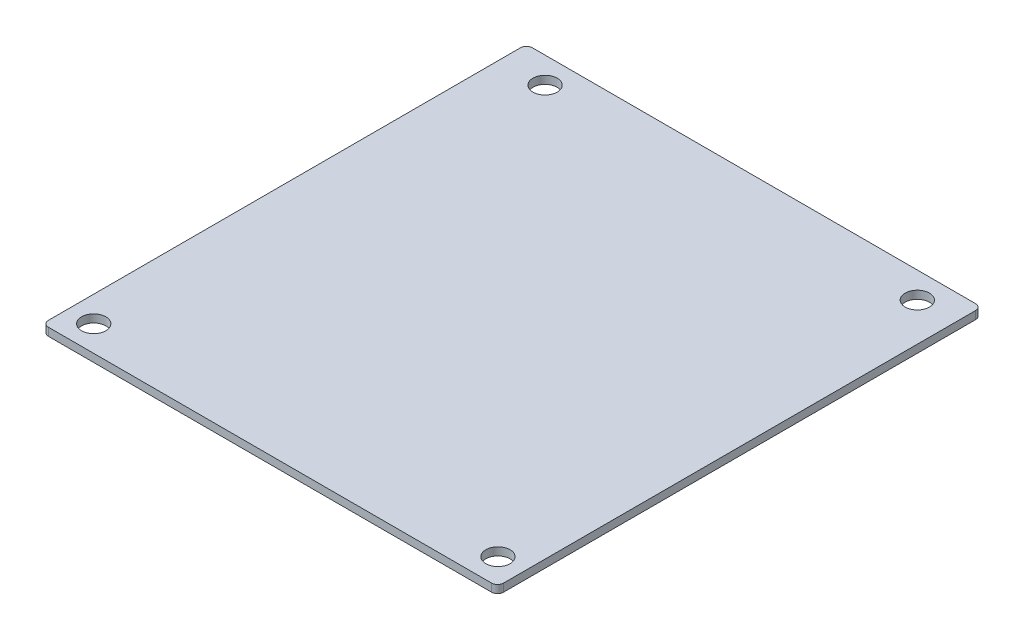
ISO-10303-21;
HEADER;
FILE_DESCRIPTION(('STEP AP214'),'2;1');
FILE_NAME('part.step','',(''),(''),'','','');
FILE_SCHEMA(('AUTOMOTIVE_DESIGN { 1 0 10303 214 1 1 1 1 }'));
ENDSEC;
DATA;
#1=APPLICATION_CONTEXT('core data for automotive mechanical design processes');
#2=APPLICATION_PROTOCOL_DEFINITION('international standard','automotive_design',2000,#1);
#3=PRODUCT_CONTEXT('',#1,'mechanical');
#4=PRODUCT('Part','Part','',(#3));
#5=PRODUCT_RELATED_PRODUCT_CATEGORY('part','',(#4));
#6=PRODUCT_DEFINITION_FORMATION('','',#4);
#7=PRODUCT_DEFINITION_CONTEXT('part definition',#1,'design');
#8=PRODUCT_DEFINITION('design','',#6,#7);
#9=PRODUCT_DEFINITION_SHAPE('','',#8);
#10=(LENGTH_UNIT() NAMED_UNIT(*) SI_UNIT(.MILLI.,.METRE.));
#11=(NAMED_UNIT(*) PLANE_ANGLE_UNIT() SI_UNIT($,.RADIAN.));
#12=(NAMED_UNIT(*) SI_UNIT($,.STERADIAN.) SOLID_ANGLE_UNIT());
#13=UNCERTAINTY_MEASURE_WITH_UNIT(LENGTH_MEASURE(1.E-05),#10,'distance_accuracy_value','');
#14=(GEOMETRIC_REPRESENTATION_CONTEXT(3) GLOBAL_UNCERTAINTY_ASSIGNED_CONTEXT((#13)) GLOBAL_UNIT_ASSIGNED_CONTEXT((#10,
#11,#12)) REPRESENTATION_CONTEXT('',''));
#15=CARTESIAN_POINT('',(0.,0.,0.));
#16=DIRECTION('',(0.,0.,1.));
#17=DIRECTION('',(1.,0.,0.));
#18=AXIS2_PLACEMENT_3D('',#15,#16,#17);
#19=CARTESIAN_POINT('',(45.085,1.57,47.945));
#20=DIRECTION('',(-1.,0.,0.));
#21=DIRECTION('',(0.,0.,1.));
#22=AXIS2_PLACEMENT_3D('',#19,#20,#21);
#23=PLANE('',#22);
#24=DIRECTION('',(0.,0.,-1.));
#25=VECTOR('',#24,1.);
#26=CARTESIAN_POINT('',(45.085,0.,47.945));
#27=LINE('',#26,#25);
#28=CARTESIAN_POINT('',(45.085,0.,46.745));
#29=VERTEX_POINT('',#28);
#30=CARTESIAN_POINT('',(45.085,0.,-46.745));
#31=VERTEX_POINT('',#30);
#32=EDGE_CURVE('E113',#29,#31,#27,.T.);
#33=ORIENTED_EDGE('',*,*,#32,.T.);
#34=DIRECTION('',(0.,-1.,0.));
#35=VECTOR('',#34,1.);
#36=CARTESIAN_POINT('',(45.085,1.57,-46.745));
#37=LINE('',#36,#35);
#38=CARTESIAN_POINT('',(45.085,1.57,-46.745));
#39=VERTEX_POINT('',#38);
#40=EDGE_CURVE('E144',#31,#39,#37,.F.);
#41=ORIENTED_EDGE('',*,*,#40,.T.);
#42=DIRECTION('',(0.,0.,-1.));
#43=VECTOR('',#42,1.);
#44=CARTESIAN_POINT('',(45.085,1.57,47.945));
#45=LINE('',#44,#43);
#46=CARTESIAN_POINT('',(45.085,1.57,46.745));
#47=VERTEX_POINT('',#46);
#48=EDGE_CURVE('E116',#47,#39,#45,.T.);
#49=ORIENTED_EDGE('',*,*,#48,.F.);
#50=DIRECTION('',(0.,-1.,0.));
#51=VECTOR('',#50,1.);
#52=CARTESIAN_POINT('',(45.085,1.57,46.745));
#53=LINE('',#52,#51);
#54=EDGE_CURVE('E105',#47,#29,#53,.T.);
#55=ORIENTED_EDGE('',*,*,#54,.T.);
#56=EDGE_LOOP('',(#33,#41,#49,#55));
#57=FACE_BOUND('',#56,.T.);
#58=ADVANCED_FACE('F35',(#57),#23,.F.);
#59=CARTESIAN_POINT('',(-45.085,1.57,-47.945));
#60=DIRECTION('',(0.,0.,1.));
#61=DIRECTION('',(1.,0.,0.));
#62=AXIS2_PLACEMENT_3D('',#59,#60,#61);
#63=PLANE('',#62);
#64=DIRECTION('',(-1.,0.,0.));
#65=VECTOR('',#64,1.);
#66=CARTESIAN_POINT('',(-45.085,0.,-47.945));
#67=LINE('',#66,#65);
#68=CARTESIAN_POINT('',(43.885,0.,-47.945));
#69=VERTEX_POINT('',#68);
#70=CARTESIAN_POINT('',(-43.885,0.,-47.945));
#71=VERTEX_POINT('',#70);
#72=EDGE_CURVE('E122',#69,#71,#67,.T.);
#73=ORIENTED_EDGE('',*,*,#72,.T.);
#74=DIRECTION('',(0.,-1.,0.));
#75=VECTOR('',#74,1.);
#76=CARTESIAN_POINT('',(-43.885,1.57,-47.945));
#77=LINE('',#76,#75);
#78=CARTESIAN_POINT('',(-43.885,1.57,-47.945));
#79=VERTEX_POINT('',#78);
#80=EDGE_CURVE('E153',#71,#79,#77,.F.);
#81=ORIENTED_EDGE('',*,*,#80,.T.);
#82=DIRECTION('',(-1.,0.,0.));
#83=VECTOR('',#82,1.);
#84=CARTESIAN_POINT('',(-45.085,1.57,-47.945));
#85=LINE('',#84,#83);
#86=CARTESIAN_POINT('',(43.885,1.57,-47.945));
#87=VERTEX_POINT('',#86);
#88=EDGE_CURVE('E172',#87,#79,#85,.T.);
#89=ORIENTED_EDGE('',*,*,#88,.F.);
#90=DIRECTION('',(0.,-1.,0.));
#91=VECTOR('',#90,1.);
#92=CARTESIAN_POINT('',(43.885,1.57,-47.945));
#93=LINE('',#92,#91);
#94=EDGE_CURVE('E140',#87,#69,#93,.T.);
#95=ORIENTED_EDGE('',*,*,#94,.T.);
#96=EDGE_LOOP('',(#73,#81,#89,#95));
#97=FACE_BOUND('',#96,.T.);
#98=ADVANCED_FACE('F229',(#97),#63,.F.);
#99=CARTESIAN_POINT('',(-45.085,1.57,47.945));
#100=DIRECTION('',(1.,0.,0.));
#101=DIRECTION('',(0.,0.,-1.));
#102=AXIS2_PLACEMENT_3D('',#99,#100,#101);
#103=PLANE('',#102);
#104=DIRECTION('',(0.,0.,1.));
#105=VECTOR('',#104,1.);
#106=CARTESIAN_POINT('',(-45.085,0.,47.945));
#107=LINE('',#106,#105);
#108=CARTESIAN_POINT('',(-45.085,0.,-46.745));
#109=VERTEX_POINT('',#108);
#110=CARTESIAN_POINT('',(-45.085,0.,46.745));
#111=VERTEX_POINT('',#110);
#112=EDGE_CURVE('E126',#109,#111,#107,.T.);
#113=ORIENTED_EDGE('',*,*,#112,.T.);
#114=DIRECTION('',(0.,-1.,0.));
#115=VECTOR('',#114,1.);
#116=CARTESIAN_POINT('',(-45.085,1.57,46.745));
#117=LINE('',#116,#115);
#118=CARTESIAN_POINT('',(-45.085,1.57,46.745));
#119=VERTEX_POINT('',#118);
#120=EDGE_CURVE('E43',#111,#119,#117,.F.);
#121=ORIENTED_EDGE('',*,*,#120,.T.);
#122=DIRECTION('',(0.,0.,1.));
#123=VECTOR('',#122,1.);
#124=CARTESIAN_POINT('',(-45.085,1.57,47.945));
#125=LINE('',#124,#123);
#126=CARTESIAN_POINT('',(-45.085,1.57,-46.745));
#127=VERTEX_POINT('',#126);
#128=EDGE_CURVE('E168',#127,#119,#125,.T.);
#129=ORIENTED_EDGE('',*,*,#128,.F.);
#130=DIRECTION('',(0.,-1.,0.));
#131=VECTOR('',#130,1.);
#132=CARTESIAN_POINT('',(-45.085,1.57,-46.745));
#133=LINE('',#132,#131);
#134=EDGE_CURVE('E148',#127,#109,#133,.T.);
#135=ORIENTED_EDGE('',*,*,#134,.T.);
#136=EDGE_LOOP('',(#113,#121,#129,#135));
#137=FACE_BOUND('',#136,.T.);
#138=ADVANCED_FACE('F234',(#137),#103,.F.);
#139=CARTESIAN_POINT('',(-45.085,1.57,47.945));
#140=DIRECTION('',(0.,0.,-1.));
#141=DIRECTION('',(-1.,0.,0.));
#142=AXIS2_PLACEMENT_3D('',#139,#140,#141);
#143=PLANE('',#142);
#144=DIRECTION('',(1.,0.,0.));
#145=VECTOR('',#144,1.);
#146=CARTESIAN_POINT('',(-45.085,1.57,47.945));
#147=LINE('',#146,#145);
#148=CARTESIAN_POINT('',(-43.885,1.57,47.945));
#149=VERTEX_POINT('',#148);
#150=CARTESIAN_POINT('',(43.885,1.57,47.945));
#151=VERTEX_POINT('',#150);
#152=EDGE_CURVE('E117',#149,#151,#147,.T.);
#153=ORIENTED_EDGE('',*,*,#152,.F.);
#154=DIRECTION('',(0.,-1.,0.));
#155=VECTOR('',#154,1.);
#156=CARTESIAN_POINT('',(-43.885,1.57,47.945));
#157=LINE('',#156,#155);
#158=CARTESIAN_POINT('',(-43.885,0.,47.945));
#159=VERTEX_POINT('',#158);
#160=EDGE_CURVE('E157',#149,#159,#157,.T.);
#161=ORIENTED_EDGE('',*,*,#160,.T.);
#162=DIRECTION('',(1.,0.,0.));
#163=VECTOR('',#162,1.);
#164=CARTESIAN_POINT('',(-45.085,0.,47.945));
#165=LINE('',#164,#163);
#166=CARTESIAN_POINT('',(43.885,0.,47.945));
#167=VERTEX_POINT('',#166);
#168=EDGE_CURVE('E135',#159,#167,#165,.T.);
#169=ORIENTED_EDGE('',*,*,#168,.T.);
#170=DIRECTION('',(0.,-1.,0.));
#171=VECTOR('',#170,1.);
#172=CARTESIAN_POINT('',(43.885,1.57,47.945));
#173=LINE('',#172,#171);
#174=EDGE_CURVE('E107',#167,#151,#173,.F.);
#175=ORIENTED_EDGE('',*,*,#174,.T.);
#176=EDGE_LOOP('',(#153,#161,#169,#175));
#177=FACE_BOUND('',#176,.T.);
#178=ADVANCED_FACE('F163',(#177),#143,.F.);
#179=CARTESIAN_POINT('',(0.,1.57,0.));
#180=DIRECTION('',(0.,-1.,0.));
#181=DIRECTION('',(0.,0.,-1.));
#182=AXIS2_PLACEMENT_3D('',#179,#180,#181);
#183=PLANE('',#182);
#184=CARTESIAN_POINT('',(37.515,1.57,-42.785));
#185=DIRECTION('',(0.,1.,0.));
#186=DIRECTION('',(0.,0.,1.));
#187=AXIS2_PLACEMENT_3D('',#184,#185,#186);
#188=CIRCLE('',#187,2.4);
#189=CARTESIAN_POINT('',(37.515,1.57,-40.385));
#190=VERTEX_POINT('',#189);
#191=EDGE_CURVE('E191',#190,#190,#188,.T.);
#192=ORIENTED_EDGE('',*,*,#191,.F.);
#193=EDGE_LOOP('',(#192));
#194=FACE_BOUND('',#193,.T.);
#195=CARTESIAN_POINT('',(-36.235,1.57,-42.785));
#196=DIRECTION('',(0.,1.,0.));
#197=DIRECTION('',(0.,0.,1.));
#198=AXIS2_PLACEMENT_3D('',#195,#196,#197);
#199=CIRCLE('',#198,2.4);
#200=CARTESIAN_POINT('',(-36.235,1.57,-40.385));
#201=VERTEX_POINT('',#200);
#202=EDGE_CURVE('E185',#201,#201,#199,.T.);
#203=ORIENTED_EDGE('',*,*,#202,.F.);
#204=EDGE_LOOP('',(#203));
#205=FACE_BOUND('',#204,.T.);
#206=CARTESIAN_POINT('',(40.005,1.57,42.785));
#207=DIRECTION('',(0.,1.,0.));
#208=DIRECTION('',(0.,0.,1.));
#209=AXIS2_PLACEMENT_3D('',#206,#207,#208);
#210=CIRCLE('',#209,2.4);
#211=CARTESIAN_POINT('',(40.005,1.57,45.185));
#212=VERTEX_POINT('',#211);
#213=EDGE_CURVE('E179',#212,#212,#210,.T.);
#214=ORIENTED_EDGE('',*,*,#213,.F.);
#215=EDGE_LOOP('',(#214));
#216=FACE_BOUND('',#215,.T.);
#217=CARTESIAN_POINT('',(-40.005,1.57,42.865));
#218=DIRECTION('',(0.,1.,0.));
#219=DIRECTION('',(0.,0.,1.));
#220=AXIS2_PLACEMENT_3D('',#217,#218,#219);
#221=CIRCLE('',#220,2.4);
#222=CARTESIAN_POINT('',(-40.005,1.57,45.265));
#223=VERTEX_POINT('',#222);
#224=EDGE_CURVE('E129',#223,#223,#221,.T.);
#225=ORIENTED_EDGE('',*,*,#224,.F.);
#226=EDGE_LOOP('',(#225));
#227=FACE_BOUND('',#226,.T.);
#228=ORIENTED_EDGE('',*,*,#128,.T.);
#229=CARTESIAN_POINT('',(-43.885,1.57,46.745));
#230=DIRECTION('',(0.,-1.,0.));
#231=DIRECTION('',(0.,0.,-1.));
#232=AXIS2_PLACEMENT_3D('',#229,#230,#231);
#233=CIRCLE('',#232,1.2);
#234=EDGE_CURVE('E11',#119,#149,#233,.F.);
#235=ORIENTED_EDGE('',*,*,#234,.T.);
#236=ORIENTED_EDGE('',*,*,#152,.T.);
#237=CARTESIAN_POINT('',(43.885,1.57,46.745));
#238=DIRECTION('',(0.,-1.,0.));
#239=DIRECTION('',(0.,0.,-1.));
#240=AXIS2_PLACEMENT_3D('',#237,#238,#239);
#241=CIRCLE('',#240,1.2);
#242=EDGE_CURVE('E138',#151,#47,#241,.F.);
#243=ORIENTED_EDGE('',*,*,#242,.T.);
#244=ORIENTED_EDGE('',*,*,#48,.T.);
#245=CARTESIAN_POINT('',(43.885,1.57,-46.745));
#246=DIRECTION('',(0.,-1.,0.));
#247=DIRECTION('',(0.,0.,-1.));
#248=AXIS2_PLACEMENT_3D('',#245,#246,#247);
#249=CIRCLE('',#248,1.2);
#250=EDGE_CURVE('E146',#39,#87,#249,.F.);
#251=ORIENTED_EDGE('',*,*,#250,.T.);
#252=ORIENTED_EDGE('',*,*,#88,.T.);
#253=CARTESIAN_POINT('',(-43.885,1.57,-46.745));
#254=DIRECTION('',(0.,-1.,0.));
#255=DIRECTION('',(0.,0.,-1.));
#256=AXIS2_PLACEMENT_3D('',#253,#254,#255);
#257=CIRCLE('',#256,1.2);
#258=EDGE_CURVE('E155',#79,#127,#257,.F.);
#259=ORIENTED_EDGE('',*,*,#258,.T.);
#260=EDGE_LOOP('',(#228,#235,#236,#243,#244,#251,#252,#259));
#261=FACE_BOUND('',#260,.T.);
#262=ADVANCED_FACE('F167',(#194,#205,#216,#227,#261),#183,.F.);
#263=CARTESIAN_POINT('',(0.,0.,0.));
#264=DIRECTION('',(0.,-1.,0.));
#265=DIRECTION('',(0.,0.,-1.));
#266=AXIS2_PLACEMENT_3D('',#263,#264,#265);
#267=PLANE('',#266);
#268=CARTESIAN_POINT('',(37.515,0.,-42.785));
#269=DIRECTION('',(0.,1.,0.));
#270=DIRECTION('',(0.,0.,1.));
#271=AXIS2_PLACEMENT_3D('',#268,#269,#270);
#272=CIRCLE('',#271,2.4);
#273=CARTESIAN_POINT('',(37.515,0.,-40.385));
#274=VERTEX_POINT('',#273);
#275=EDGE_CURVE('E188',#274,#274,#272,.T.);
#276=ORIENTED_EDGE('',*,*,#275,.T.);
#277=EDGE_LOOP('',(#276));
#278=FACE_BOUND('',#277,.T.);
#279=CARTESIAN_POINT('',(-36.235,0.,-42.785));
#280=DIRECTION('',(0.,1.,0.));
#281=DIRECTION('',(0.,0.,1.));
#282=AXIS2_PLACEMENT_3D('',#279,#280,#281);
#283=CIRCLE('',#282,2.4);
#284=CARTESIAN_POINT('',(-36.235,0.,-40.385));
#285=VERTEX_POINT('',#284);
#286=EDGE_CURVE('E182',#285,#285,#283,.T.);
#287=ORIENTED_EDGE('',*,*,#286,.T.);
#288=EDGE_LOOP('',(#287));
#289=FACE_BOUND('',#288,.T.);
#290=CARTESIAN_POINT('',(40.005,0.,42.785));
#291=DIRECTION('',(0.,1.,0.));
#292=DIRECTION('',(0.,0.,1.));
#293=AXIS2_PLACEMENT_3D('',#290,#291,#292);
#294=CIRCLE('',#293,2.4);
#295=CARTESIAN_POINT('',(40.005,0.,45.185));
#296=VERTEX_POINT('',#295);
#297=EDGE_CURVE('E177',#296,#296,#294,.T.);
#298=ORIENTED_EDGE('',*,*,#297,.T.);
#299=EDGE_LOOP('',(#298));
#300=FACE_BOUND('',#299,.T.);
#301=CARTESIAN_POINT('',(-40.005,0.,42.865));
#302=DIRECTION('',(0.,1.,0.));
#303=DIRECTION('',(0.,0.,1.));
#304=AXIS2_PLACEMENT_3D('',#301,#302,#303);
#305=CIRCLE('',#304,2.4);
#306=CARTESIAN_POINT('',(-40.005,0.,45.265));
#307=VERTEX_POINT('',#306);
#308=EDGE_CURVE('E123',#307,#307,#305,.T.);
#309=ORIENTED_EDGE('',*,*,#308,.T.);
#310=EDGE_LOOP('',(#309));
#311=FACE_BOUND('',#310,.T.);
#312=ORIENTED_EDGE('',*,*,#168,.F.);
#313=CARTESIAN_POINT('',(-43.885,0.,46.745));
#314=DIRECTION('',(0.,-1.,0.));
#315=DIRECTION('',(0.,0.,-1.));
#316=AXIS2_PLACEMENT_3D('',#313,#314,#315);
#317=CIRCLE('',#316,1.2);
#318=EDGE_CURVE('E57',#159,#111,#317,.T.);
#319=ORIENTED_EDGE('',*,*,#318,.T.);
#320=ORIENTED_EDGE('',*,*,#112,.F.);
#321=CARTESIAN_POINT('',(-43.885,0.,-46.745));
#322=DIRECTION('',(0.,-1.,0.));
#323=DIRECTION('',(0.,0.,-1.));
#324=AXIS2_PLACEMENT_3D('',#321,#322,#323);
#325=CIRCLE('',#324,1.2);
#326=EDGE_CURVE('E151',#109,#71,#325,.T.);
#327=ORIENTED_EDGE('',*,*,#326,.T.);
#328=ORIENTED_EDGE('',*,*,#72,.F.);
#329=CARTESIAN_POINT('',(43.885,0.,-46.745));
#330=DIRECTION('',(0.,-1.,0.));
#331=DIRECTION('',(0.,0.,-1.));
#332=AXIS2_PLACEMENT_3D('',#329,#330,#331);
#333=CIRCLE('',#332,1.2);
#334=EDGE_CURVE('E121',#69,#31,#333,.T.);
#335=ORIENTED_EDGE('',*,*,#334,.T.);
#336=ORIENTED_EDGE('',*,*,#32,.F.);
#337=CARTESIAN_POINT('',(43.885,0.,46.745));
#338=DIRECTION('',(0.,-1.,0.));
#339=DIRECTION('',(0.,0.,-1.));
#340=AXIS2_PLACEMENT_3D('',#337,#338,#339);
#341=CIRCLE('',#340,1.2);
#342=EDGE_CURVE('E101',#29,#167,#341,.T.);
#343=ORIENTED_EDGE('',*,*,#342,.T.);
#344=EDGE_LOOP('',(#312,#319,#320,#327,#328,#335,#336,#343));
#345=FACE_BOUND('',#344,.T.);
#346=ADVANCED_FACE('F119',(#278,#289,#300,#311,#345),#267,.T.);
#347=CARTESIAN_POINT('',(-40.005,0.,42.865));
#348=DIRECTION('',(0.,1.,0.));
#349=DIRECTION('',(0.,0.,1.));
#350=AXIS2_PLACEMENT_3D('',#347,#348,#349);
#351=CYLINDRICAL_SURFACE('',#350,2.4);
#352=ORIENTED_EDGE('',*,*,#308,.F.);
#353=EDGE_LOOP('',(#352));
#354=FACE_BOUND('',#353,.T.);
#355=ORIENTED_EDGE('',*,*,#224,.T.);
#356=EDGE_LOOP('',(#355));
#357=FACE_BOUND('',#356,.T.);
#358=ADVANCED_FACE('F215',(#354,#357),#351,.F.);
#359=CARTESIAN_POINT('',(40.005,0.,42.785));
#360=DIRECTION('',(0.,1.,0.));
#361=DIRECTION('',(0.,0.,1.));
#362=AXIS2_PLACEMENT_3D('',#359,#360,#361);
#363=CYLINDRICAL_SURFACE('',#362,2.4);
#364=ORIENTED_EDGE('',*,*,#297,.F.);
#365=EDGE_LOOP('',(#364));
#366=FACE_BOUND('',#365,.T.);
#367=ORIENTED_EDGE('',*,*,#213,.T.);
#368=EDGE_LOOP('',(#367));
#369=FACE_BOUND('',#368,.T.);
#370=ADVANCED_FACE('F217',(#366,#369),#363,.F.);
#371=CARTESIAN_POINT('',(-36.235,0.,-42.785));
#372=DIRECTION('',(0.,1.,0.));
#373=DIRECTION('',(0.,0.,1.));
#374=AXIS2_PLACEMENT_3D('',#371,#372,#373);
#375=CYLINDRICAL_SURFACE('',#374,2.4);
#376=ORIENTED_EDGE('',*,*,#286,.F.);
#377=EDGE_LOOP('',(#376));
#378=FACE_BOUND('',#377,.T.);
#379=ORIENTED_EDGE('',*,*,#202,.T.);
#380=EDGE_LOOP('',(#379));
#381=FACE_BOUND('',#380,.T.);
#382=ADVANCED_FACE('F202',(#378,#381),#375,.F.);
#383=CARTESIAN_POINT('',(37.515,0.,-42.785));
#384=DIRECTION('',(0.,1.,0.));
#385=DIRECTION('',(0.,0.,1.));
#386=AXIS2_PLACEMENT_3D('',#383,#384,#385);
#387=CYLINDRICAL_SURFACE('',#386,2.4);
#388=ORIENTED_EDGE('',*,*,#275,.F.);
#389=EDGE_LOOP('',(#388));
#390=FACE_BOUND('',#389,.T.);
#391=ORIENTED_EDGE('',*,*,#191,.T.);
#392=EDGE_LOOP('',(#391));
#393=FACE_BOUND('',#392,.T.);
#394=ADVANCED_FACE('F199',(#390,#393),#387,.F.);
#395=CARTESIAN_POINT('',(43.885,1.57,46.745));
#396=DIRECTION('',(0.,-1.,0.));
#397=DIRECTION('',(0.,0.,-1.));
#398=AXIS2_PLACEMENT_3D('',#395,#396,#397);
#399=CYLINDRICAL_SURFACE('',#398,1.2);
#400=ORIENTED_EDGE('',*,*,#242,.F.);
#401=ORIENTED_EDGE('',*,*,#174,.F.);
#402=ORIENTED_EDGE('',*,*,#342,.F.);
#403=ORIENTED_EDGE('',*,*,#54,.F.);
#404=EDGE_LOOP('',(#400,#401,#402,#403));
#405=FACE_BOUND('',#404,.T.);
#406=ADVANCED_FACE('F104',(#405),#399,.T.);
#407=CARTESIAN_POINT('',(43.885,1.57,-46.745));
#408=DIRECTION('',(0.,-1.,0.));
#409=DIRECTION('',(0.,0.,-1.));
#410=AXIS2_PLACEMENT_3D('',#407,#408,#409);
#411=CYLINDRICAL_SURFACE('',#410,1.2);
#412=ORIENTED_EDGE('',*,*,#250,.F.);
#413=ORIENTED_EDGE('',*,*,#40,.F.);
#414=ORIENTED_EDGE('',*,*,#334,.F.);
#415=ORIENTED_EDGE('',*,*,#94,.F.);
#416=EDGE_LOOP('',(#412,#413,#414,#415));
#417=FACE_BOUND('',#416,.T.);
#418=ADVANCED_FACE('F241',(#417),#411,.T.);
#419=CARTESIAN_POINT('',(-43.885,1.57,-46.745));
#420=DIRECTION('',(0.,-1.,0.));
#421=DIRECTION('',(0.,0.,-1.));
#422=AXIS2_PLACEMENT_3D('',#419,#420,#421);
#423=CYLINDRICAL_SURFACE('',#422,1.2);
#424=ORIENTED_EDGE('',*,*,#258,.F.);
#425=ORIENTED_EDGE('',*,*,#80,.F.);
#426=ORIENTED_EDGE('',*,*,#326,.F.);
#427=ORIENTED_EDGE('',*,*,#134,.F.);
#428=EDGE_LOOP('',(#424,#425,#426,#427));
#429=FACE_BOUND('',#428,.T.);
#430=ADVANCED_FACE('F243',(#429),#423,.T.);
#431=CARTESIAN_POINT('',(-43.885,1.57,46.745));
#432=DIRECTION('',(0.,-1.,0.));
#433=DIRECTION('',(0.,0.,-1.));
#434=AXIS2_PLACEMENT_3D('',#431,#432,#433);
#435=CYLINDRICAL_SURFACE('',#434,1.2);
#436=ORIENTED_EDGE('',*,*,#234,.F.);
#437=ORIENTED_EDGE('',*,*,#120,.F.);
#438=ORIENTED_EDGE('',*,*,#318,.F.);
#439=ORIENTED_EDGE('',*,*,#160,.F.);
#440=EDGE_LOOP('',(#436,#437,#438,#439));
#441=FACE_BOUND('',#440,.T.);
#442=ADVANCED_FACE('F37',(#441),#435,.T.);
#443=CLOSED_SHELL('',(#58,#98,#138,#178,#262,#346,#358,#370,#382,#394,#406,#418,#430,#442));
#444=MANIFOLD_SOLID_BREP('B2',#443);
#445=ADVANCED_BREP_SHAPE_REPRESENTATION('',(#18,#444),#14);
#446=SHAPE_DEFINITION_REPRESENTATION(#9,#445);
ENDSEC;
END-ISO-10303-21;
